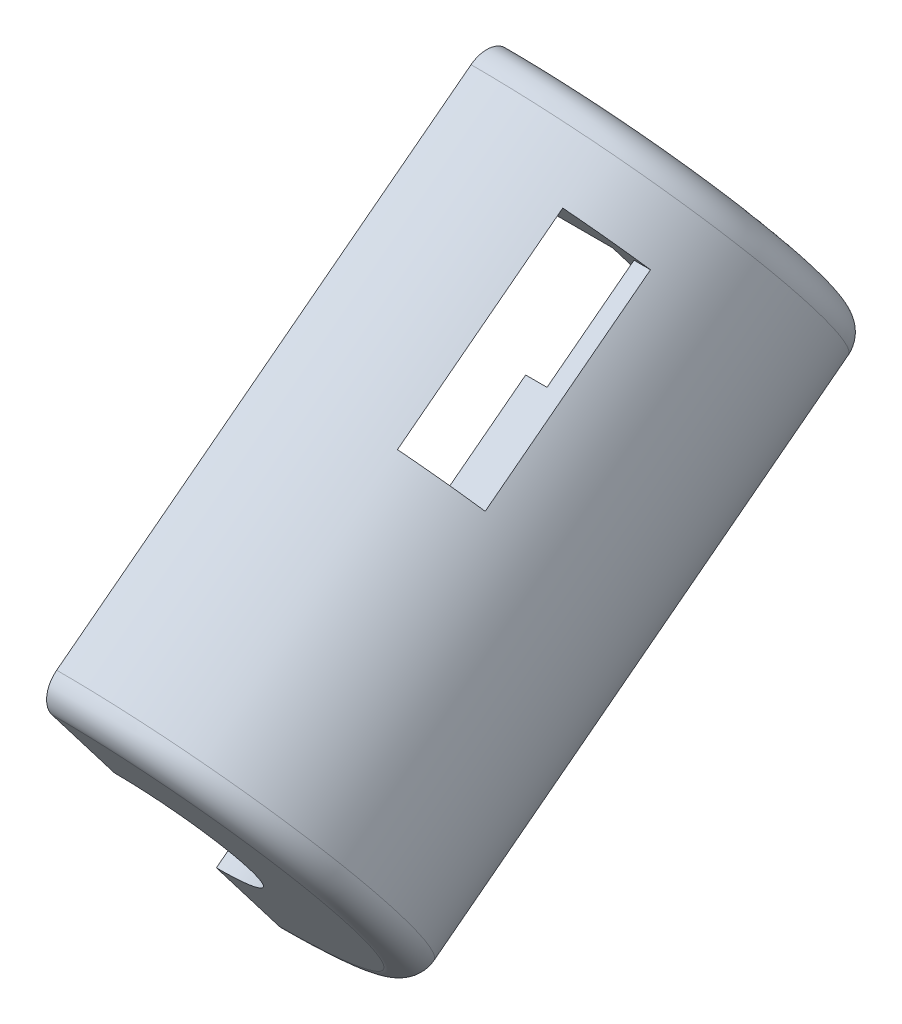
ISO-10303-21;
HEADER;
FILE_DESCRIPTION(('STEP AP214'),'2;1');
FILE_NAME('part.step','',(''),(''),'','','');
FILE_SCHEMA(('AUTOMOTIVE_DESIGN { 1 0 10303 214 1 1 1 1 }'));
ENDSEC;
DATA;
#1=APPLICATION_CONTEXT('core data for automotive mechanical design processes');
#2=APPLICATION_PROTOCOL_DEFINITION('international standard','automotive_design',2000,#1);
#3=PRODUCT_CONTEXT('',#1,'mechanical');
#4=PRODUCT('Part','Part','',(#3));
#5=PRODUCT_RELATED_PRODUCT_CATEGORY('part','',(#4));
#6=PRODUCT_DEFINITION_FORMATION('','',#4);
#7=PRODUCT_DEFINITION_CONTEXT('part definition',#1,'design');
#8=PRODUCT_DEFINITION('design','',#6,#7);
#9=PRODUCT_DEFINITION_SHAPE('','',#8);
#10=(LENGTH_UNIT() NAMED_UNIT(*) SI_UNIT(.MILLI.,.METRE.));
#11=(NAMED_UNIT(*) PLANE_ANGLE_UNIT() SI_UNIT($,.RADIAN.));
#12=(NAMED_UNIT(*) SI_UNIT($,.STERADIAN.) SOLID_ANGLE_UNIT());
#13=UNCERTAINTY_MEASURE_WITH_UNIT(LENGTH_MEASURE(1.E-05),#10,'distance_accuracy_value','');
#14=(GEOMETRIC_REPRESENTATION_CONTEXT(3) GLOBAL_UNCERTAINTY_ASSIGNED_CONTEXT((#13)) GLOBAL_UNIT_ASSIGNED_CONTEXT((#10,
#11,#12)) REPRESENTATION_CONTEXT('',''));
#15=CARTESIAN_POINT('',(0.,0.,0.));
#16=DIRECTION('',(0.,0.,1.));
#17=DIRECTION('',(1.,0.,0.));
#18=AXIS2_PLACEMENT_3D('',#15,#16,#17);
#19=CARTESIAN_POINT('',(88.,103.26130128257,131.19163509689));
#20=DIRECTION('',(0.,-0.607891189803704,0.794020340645652));
#21=DIRECTION('',(0.,0.794020340645652,0.607891189803704));
#22=AXIS2_PLACEMENT_3D('',#19,#20,#21);
#23=PLANE('',#22);
#24=DIRECTION('',(0.,0.794020340645652,0.607891189803704));
#25=VECTOR('',#24,1.);
#26=CARTESIAN_POINT('',(40.2,84.2048131070744,116.602246541601));
#27=LINE('',#26,#25);
#28=CARTESIAN_POINT('',(40.2,84.2048131070744,116.602246541601));
#29=VERTEX_POINT('',#28);
#30=CARTESIAN_POINT('',(40.2,100.085219919987,128.760070337675));
#31=VERTEX_POINT('',#30);
#32=EDGE_CURVE('E189',#29,#31,#27,.T.);
#33=ORIENTED_EDGE('',*,*,#32,.F.);
#34=DIRECTION('',(-1.,0.,0.));
#35=VECTOR('',#34,1.);
#36=CARTESIAN_POINT('',(88.,84.2048131070744,116.602246541601));
#37=LINE('',#36,#35);
#38=CARTESIAN_POINT('',(30.,84.2048131070744,116.602246541601));
#39=VERTEX_POINT('',#38);
#40=EDGE_CURVE('E199',#29,#39,#37,.T.);
#41=ORIENTED_EDGE('',*,*,#40,.T.);
#42=DIRECTION('',(0.,-0.794020340645652,-0.607891189803704));
#43=VECTOR('',#42,1.);
#44=CARTESIAN_POINT('',(30.,84.2048131070744,116.602246541601));
#45=LINE('',#44,#43);
#46=CARTESIAN_POINT('',(30.,81.0287317444918,114.170681782386));
#47=VERTEX_POINT('',#46);
#48=EDGE_CURVE('E252',#39,#47,#45,.T.);
#49=ORIENTED_EDGE('',*,*,#48,.T.);
#50=DIRECTION('',(-1.,0.,0.));
#51=VECTOR('',#50,1.);
#52=CARTESIAN_POINT('',(88.,81.0287317444918,114.170681782386));
#53=LINE('',#52,#51);
#54=CARTESIAN_POINT('',(38.7017386664809,81.0287317444918,114.170681782386));
#55=VERTEX_POINT('',#54);
#56=EDGE_CURVE('E269',#47,#55,#53,.F.);
#57=ORIENTED_EDGE('',*,*,#56,.T.);
#58=CARTESIAN_POINT('',(30.,92.1600287928982,122.692651636851));
#59=DIRECTION('',(0.,0.607891189803704,-0.794020340645652));
#60=DIRECTION('',(0.,0.794020340645652,0.607891189803704));
#61=AXIS2_PLACEMENT_3D('',#58,#59,#60);
#62=CIRCLE('',#61,16.5);
#63=CARTESIAN_POINT('',(43.1099774663335,84.2048131070744,116.602246541601));
#64=VERTEX_POINT('',#63);
#65=EDGE_CURVE('E27',#55,#64,#62,.F.);
#66=ORIENTED_EDGE('',*,*,#65,.T.);
#67=DIRECTION('',(-1.,0.,0.));
#68=VECTOR('',#67,1.);
#69=CARTESIAN_POINT('',(88.,84.2048131070744,116.602246541601));
#70=LINE('',#69,#68);
#71=CARTESIAN_POINT('',(41.8267285911098,84.2048131070744,116.602246541601));
#72=VERTEX_POINT('',#71);
#73=EDGE_CURVE('E207',#72,#64,#70,.F.);
#74=ORIENTED_EDGE('',*,*,#73,.F.);
#75=CARTESIAN_POINT('',(30.,92.1600287928982,122.692651636851));
#76=DIRECTION('',(0.,-0.607891189803704,0.794020340645652));
#77=DIRECTION('',(0.,-0.794020340645652,-0.607891189803704));
#78=AXIS2_PLACEMENT_3D('',#75,#76,#77);
#79=CIRCLE('',#78,15.5);
#80=CARTESIAN_POINT('',(41.8586582676119,100.085219919987,128.760070337675));
#81=VERTEX_POINT('',#80);
#82=EDGE_CURVE('E238',#72,#81,#79,.T.);
#83=ORIENTED_EDGE('',*,*,#82,.T.);
#84=DIRECTION('',(-1.,0.,0.));
#85=VECTOR('',#84,1.);
#86=CARTESIAN_POINT('',(88.,100.085219919987,128.760070337675));
#87=LINE('',#86,#85);
#88=CARTESIAN_POINT('',(43.1387889817897,100.085219919987,128.760070337675));
#89=VERTEX_POINT('',#88);
#90=EDGE_CURVE('E289',#81,#89,#87,.F.);
#91=ORIENTED_EDGE('',*,*,#90,.T.);
#92=CARTESIAN_POINT('',(30.,92.1600287928982,122.692651636851));
#93=DIRECTION('',(0.,0.607891189803704,-0.794020340645652));
#94=DIRECTION('',(0.,0.794020340645652,0.607891189803704));
#95=AXIS2_PLACEMENT_3D('',#92,#93,#94);
#96=CIRCLE('',#95,16.5);
#97=CARTESIAN_POINT('',(38.7623643644877,103.26130128257,131.19163509689));
#98=VERTEX_POINT('',#97);
#99=EDGE_CURVE('E408',#89,#98,#96,.F.);
#100=ORIENTED_EDGE('',*,*,#99,.T.);
#101=DIRECTION('',(-1.,0.,0.));
#102=VECTOR('',#101,1.);
#103=CARTESIAN_POINT('',(88.,103.26130128257,131.19163509689));
#104=LINE('',#103,#102);
#105=CARTESIAN_POINT('',(30.,103.26130128257,131.19163509689));
#106=VERTEX_POINT('',#105);
#107=EDGE_CURVE('E291',#106,#98,#104,.F.);
#108=ORIENTED_EDGE('',*,*,#107,.F.);
#109=DIRECTION('',(0.,-0.794020340645652,-0.607891189803704));
#110=VECTOR('',#109,1.);
#111=CARTESIAN_POINT('',(30.,103.26130128257,131.19163509689));
#112=LINE('',#111,#110);
#113=CARTESIAN_POINT('',(30.,100.085219919987,128.760070337675));
#114=VERTEX_POINT('',#113);
#115=EDGE_CURVE('E279',#106,#114,#112,.T.);
#116=ORIENTED_EDGE('',*,*,#115,.T.);
#117=DIRECTION('',(-1.,0.,0.));
#118=VECTOR('',#117,1.);
#119=CARTESIAN_POINT('',(88.,100.085219919987,128.760070337675));
#120=LINE('',#119,#118);
#121=EDGE_CURVE('E211',#31,#114,#120,.T.);
#122=ORIENTED_EDGE('',*,*,#121,.F.);
#123=EDGE_LOOP('',(#33,#41,#49,#57,#66,#74,#83,#91,#100,#108,#116,#122));
#124=FACE_BOUND('',#123,.T.);
#125=ADVANCED_FACE('F17',(#124),#23,.T.);
#126=CARTESIAN_POINT('',(88.,75.8616566311603,120.919854677874));
#127=DIRECTION('',(0.,0.607891189803704,-0.794020340645652));
#128=DIRECTION('',(0.,-0.794020340645652,-0.607891189803704));
#129=AXIS2_PLACEMENT_3D('',#126,#127,#128);
#130=PLANE('',#129);
#131=DIRECTION('',(0.,-0.794020340645652,-0.607891189803704));
#132=VECTOR('',#131,1.);
#133=CARTESIAN_POINT('',(40.2,94.9181448066559,135.509243233163));
#134=LINE('',#133,#132);
#135=CARTESIAN_POINT('',(40.2,94.9181448066559,135.509243233163));
#136=VERTEX_POINT('',#135);
#137=CARTESIAN_POINT('',(40.2,79.0377379937429,123.351419437089));
#138=VERTEX_POINT('',#137);
#139=EDGE_CURVE('E196',#136,#138,#134,.T.);
#140=ORIENTED_EDGE('',*,*,#139,.F.);
#141=DIRECTION('',(1.,0.,0.));
#142=VECTOR('',#141,1.);
#143=CARTESIAN_POINT('',(88.,94.9181448066559,135.509243233163));
#144=LINE('',#143,#142);
#145=CARTESIAN_POINT('',(41.8586582676119,94.9181448066559,135.509243233163));
#146=VERTEX_POINT('',#145);
#147=EDGE_CURVE('E242',#136,#146,#144,.T.);
#148=ORIENTED_EDGE('',*,*,#147,.T.);
#149=CARTESIAN_POINT('',(30.,86.9929536795667,129.441824532339));
#150=DIRECTION('',(0.,-0.607891189803704,0.794020340645652));
#151=DIRECTION('',(0.,-0.794020340645652,-0.607891189803704));
#152=AXIS2_PLACEMENT_3D('',#149,#150,#151);
#153=CIRCLE('',#152,15.5);
#154=CARTESIAN_POINT('',(41.8267285911098,79.0377379937429,123.351419437089));
#155=VERTEX_POINT('',#154);
#156=EDGE_CURVE('E237',#155,#146,#153,.T.);
#157=ORIENTED_EDGE('',*,*,#156,.F.);
#158=DIRECTION('',(-1.,0.,0.));
#159=VECTOR('',#158,1.);
#160=CARTESIAN_POINT('',(88.,79.0377379937429,123.351419437089));
#161=LINE('',#160,#159);
#162=CARTESIAN_POINT('',(43.1099774663335,79.0377379937429,123.351419437089));
#163=VERTEX_POINT('',#162);
#164=EDGE_CURVE('E264',#155,#163,#161,.F.);
#165=ORIENTED_EDGE('',*,*,#164,.T.);
#166=CARTESIAN_POINT('',(30.,86.9929536795667,129.441824532339));
#167=DIRECTION('',(0.,-0.607891189803704,0.794020340645652));
#168=DIRECTION('',(0.,-0.794020340645652,-0.607891189803704));
#169=AXIS2_PLACEMENT_3D('',#166,#167,#168);
#170=CIRCLE('',#169,16.5);
#171=CARTESIAN_POINT('',(38.7017386664809,75.8616566311603,120.919854677874));
#172=VERTEX_POINT('',#171);
#173=EDGE_CURVE('E425',#163,#172,#170,.F.);
#174=ORIENTED_EDGE('',*,*,#173,.T.);
#175=DIRECTION('',(-1.,0.,0.));
#176=VECTOR('',#175,1.);
#177=CARTESIAN_POINT('',(88.,75.8616566311603,120.919854677874));
#178=LINE('',#177,#176);
#179=CARTESIAN_POINT('',(30.,75.8616566311603,120.919854677874));
#180=VERTEX_POINT('',#179);
#181=EDGE_CURVE('E265',#180,#172,#178,.F.);
#182=ORIENTED_EDGE('',*,*,#181,.F.);
#183=DIRECTION('',(0.,0.794020340645652,0.607891189803704));
#184=VECTOR('',#183,1.);
#185=CARTESIAN_POINT('',(30.,75.8616566311603,120.919854677874));
#186=LINE('',#185,#184);
#187=CARTESIAN_POINT('',(30.,79.0377379937429,123.351419437089));
#188=VERTEX_POINT('',#187);
#189=EDGE_CURVE('E208',#180,#188,#186,.T.);
#190=ORIENTED_EDGE('',*,*,#189,.T.);
#191=DIRECTION('',(-1.,0.,0.));
#192=VECTOR('',#191,1.);
#193=CARTESIAN_POINT('',(88.,79.0377379937429,123.351419437089));
#194=LINE('',#193,#192);
#195=EDGE_CURVE('E261',#138,#188,#194,.T.);
#196=ORIENTED_EDGE('',*,*,#195,.F.);
#197=EDGE_LOOP('',(#140,#148,#157,#165,#174,#182,#190,#196));
#198=FACE_BOUND('',#197,.T.);
#199=ADVANCED_FACE('F541',(#198),#130,.T.);
#200=CARTESIAN_POINT('',(88.,94.9181448066559,135.509243233163));
#201=DIRECTION('',(0.,0.794020340645652,0.607891189803704));
#202=DIRECTION('',(-1.,0.,0.));
#203=AXIS2_PLACEMENT_3D('',#200,#201,#202);
#204=PLANE('',#203);
#205=DIRECTION('',(0.,0.607891189803704,-0.794020340645652));
#206=VECTOR('',#205,1.);
#207=CARTESIAN_POINT('',(40.2,77.8971914921522,157.741812771242));
#208=LINE('',#207,#206);
#209=CARTESIAN_POINT('',(40.2,90.2641633187529,141.588219254475));
#210=VERTEX_POINT('',#209);
#211=EDGE_CURVE('E227',#136,#210,#208,.F.);
#212=ORIENTED_EDGE('',*,*,#211,.T.);
#213=DIRECTION('',(-1.,0.,0.));
#214=VECTOR('',#213,1.);
#215=CARTESIAN_POINT('',(88.,90.2641633187529,141.588219254475));
#216=LINE('',#215,#214);
#217=CARTESIAN_POINT('',(43.1387889817897,90.2641633187529,141.588219254475));
#218=VERTEX_POINT('',#217);
#219=EDGE_CURVE('E298',#210,#218,#216,.F.);
#220=ORIENTED_EDGE('',*,*,#219,.T.);
#221=DIRECTION('',(0.,-0.607891189803704,0.794020340645652));
#222=VECTOR('',#221,1.);
#223=CARTESIAN_POINT('',(43.1387889817897,103.73256705881,123.995948293801));
#224=LINE('',#223,#222);
#225=EDGE_CURVE('E405',#218,#89,#224,.F.);
#226=ORIENTED_EDGE('',*,*,#225,.T.);
#227=ORIENTED_EDGE('',*,*,#90,.F.);
#228=DIRECTION('',(0.,-0.607891189803704,0.794020340645652));
#229=VECTOR('',#228,1.);
#230=CARTESIAN_POINT('',(41.8586582676119,100.085219919987,128.760070337675));
#231=LINE('',#230,#229);
#232=EDGE_CURVE('E249',#146,#81,#231,.F.);
#233=ORIENTED_EDGE('',*,*,#232,.F.);
#234=ORIENTED_EDGE('',*,*,#147,.F.);
#235=EDGE_LOOP('',(#212,#220,#226,#227,#233,#234));
#236=FACE_BOUND('',#235,.T.);
#237=ADVANCED_FACE('F466',(#236),#204,.T.);
#238=CARTESIAN_POINT('',(88.,79.0377379937429,123.351419437089));
#239=DIRECTION('',(0.,-0.794020340645652,-0.607891189803704));
#240=DIRECTION('',(1.,0.,0.));
#241=AXIS2_PLACEMENT_3D('',#238,#239,#240);
#242=PLANE('',#241);
#243=ORIENTED_EDGE('',*,*,#73,.T.);
#244=DIRECTION('',(0.,-0.607891189803704,0.794020340645652));
#245=VECTOR('',#244,1.);
#246=CARTESIAN_POINT('',(43.1099774663335,87.8521602458966,111.838124497727));
#247=LINE('',#246,#245);
#248=EDGE_CURVE('E416',#64,#163,#247,.T.);
#249=ORIENTED_EDGE('',*,*,#248,.T.);
#250=ORIENTED_EDGE('',*,*,#164,.F.);
#251=DIRECTION('',(0.,-0.607891189803704,0.794020340645652));
#252=VECTOR('',#251,1.);
#253=CARTESIAN_POINT('',(41.8267285911098,84.2048131070744,116.602246541601));
#254=LINE('',#253,#252);
#255=EDGE_CURVE('E11',#72,#155,#254,.T.);
#256=ORIENTED_EDGE('',*,*,#255,.F.);
#257=EDGE_LOOP('',(#243,#249,#250,#256));
#258=FACE_BOUND('',#257,.T.);
#259=ADVANCED_FACE('F535',(#258),#242,.T.);
#260=CARTESIAN_POINT('',(40.,86.6363778662892,113.426165179018));
#261=DIRECTION('',(0.,0.794020340645652,0.607891189803704));
#262=DIRECTION('',(-1.,0.,0.));
#263=AXIS2_PLACEMENT_3D('',#260,#261,#262);
#264=PLANE('',#263);
#265=DIRECTION('',(-1.,0.,0.));
#266=VECTOR('',#265,1.);
#267=CARTESIAN_POINT('',(40.,86.6363778662892,113.426165179018));
#268=LINE('',#267,#266);
#269=CARTESIAN_POINT('',(30.,86.6363778662892,113.426165179018));
#270=VERTEX_POINT('',#269);
#271=CARTESIAN_POINT('',(40.2,86.6363778662892,113.426165179018));
#272=VERTEX_POINT('',#271);
#273=EDGE_CURVE('E344',#270,#272,#268,.F.);
#274=ORIENTED_EDGE('',*,*,#273,.F.);
#275=DIRECTION('',(0.,-0.607891189803704,0.794020340645652));
#276=VECTOR('',#275,1.);
#277=CARTESIAN_POINT('',(30.,86.6363778662892,113.426165179018));
#278=LINE('',#277,#276);
#279=EDGE_CURVE('E202',#270,#39,#278,.T.);
#280=ORIENTED_EDGE('',*,*,#279,.T.);
#281=ORIENTED_EDGE('',*,*,#40,.F.);
#282=DIRECTION('',(0.,-0.607891189803704,0.794020340645652));
#283=VECTOR('',#282,1.);
#284=CARTESIAN_POINT('',(40.2,86.6363778662892,113.426165179018));
#285=LINE('',#284,#283);
#286=EDGE_CURVE('E185',#272,#29,#285,.T.);
#287=ORIENTED_EDGE('',*,*,#286,.F.);
#288=EDGE_LOOP('',(#274,#280,#281,#287));
#289=FACE_BOUND('',#288,.T.);
#290=ADVANCED_FACE('F200',(#289),#264,.T.);
#291=CARTESIAN_POINT('',(30.,95.8073759317204,117.928529592977));
#292=DIRECTION('',(0.,-0.607891189803704,0.794020340645652));
#293=DIRECTION('',(0.,0.794020340645652,0.607891189803704));
#294=AXIS2_PLACEMENT_3D('',#291,#292,#293);
#295=CYLINDRICAL_SURFACE('',#294,16.5);
#296=DIRECTION('',(0.,-0.607891189803704,0.794020340645652));
#297=VECTOR('',#296,1.);
#298=CARTESIAN_POINT('',(30.,108.908711552374,127.958734224738));
#299=LINE('',#298,#297);
#300=CARTESIAN_POINT('',(30.,107.692929172766,129.546774906029));
#301=VERTEX_POINT('',#300);
#302=CARTESIAN_POINT('',(30.,83.0733359857163,161.704598702179));
#303=VERTEX_POINT('',#302);
#304=EDGE_CURVE('E367',#301,#303,#299,.T.);
#305=ORIENTED_EDGE('',*,*,#304,.T.);
#306=CARTESIAN_POINT('',(30.,69.972000365063,151.674394070417));
#307=DIRECTION('',(0.,0.607891189803704,-0.794020340645652));
#308=DIRECTION('',(0.,0.794020340645652,0.607891189803704));
#309=AXIS2_PLACEMENT_3D('',#306,#307,#308);
#310=CIRCLE('',#309,16.5);
#311=CARTESIAN_POINT('',(30.,56.8706647444098,141.644189438656));
#312=VERTEX_POINT('',#311);
#313=EDGE_CURVE('E380',#312,#303,#310,.F.);
#314=ORIENTED_EDGE('',*,*,#313,.F.);
#315=DIRECTION('',(0.,-0.607891189803704,0.794020340645652));
#316=VECTOR('',#315,1.);
#317=CARTESIAN_POINT('',(30.,82.7060403110672,107.898324961216));
#318=LINE('',#317,#316);
#319=CARTESIAN_POINT('',(30.,81.4902579314598,109.486365642507));
#320=VERTEX_POINT('',#319);
#321=EDGE_CURVE('E361',#312,#320,#318,.F.);
#322=ORIENTED_EDGE('',*,*,#321,.T.);
#323=CARTESIAN_POINT('',(30.,94.591593552113,119.516570274268));
#324=DIRECTION('',(0.,0.607891189803704,-0.794020340645652));
#325=DIRECTION('',(0.,0.794020340645652,0.607891189803704));
#326=AXIS2_PLACEMENT_3D('',#323,#324,#325);
#327=CIRCLE('',#326,16.5);
#328=EDGE_CURVE('E388',#301,#320,#327,.T.);
#329=ORIENTED_EDGE('',*,*,#328,.F.);
#330=EDGE_LOOP('',(#305,#314,#322,#329));
#331=FACE_BOUND('',#330,.T.);
#332=ORIENTED_EDGE('',*,*,#99,.F.);
#333=ORIENTED_EDGE('',*,*,#225,.F.);
#334=CARTESIAN_POINT('',(30.,82.3389721916637,135.520800553651));
#335=DIRECTION('',(0.,-0.607891189803704,0.794020340645652));
#336=DIRECTION('',(0.,-0.794020340645652,-0.607891189803704));
#337=AXIS2_PLACEMENT_3D('',#334,#335,#336);
#338=CIRCLE('',#337,16.5);
#339=CARTESIAN_POINT('',(38.7623643644877,93.4402446813355,144.019784013689));
#340=VERTEX_POINT('',#339);
#341=EDGE_CURVE('E402',#340,#218,#338,.F.);
#342=ORIENTED_EDGE('',*,*,#341,.F.);
#343=DIRECTION('',(0.,-0.607891189803704,0.794020340645652));
#344=VECTOR('',#343,1.);
#345=CARTESIAN_POINT('',(38.7623643644877,106.908648421392,126.427513053016));
#346=LINE('',#345,#344);
#347=EDGE_CURVE('E412',#98,#340,#346,.T.);
#348=ORIENTED_EDGE('',*,*,#347,.F.);
#349=EDGE_LOOP('',(#332,#333,#342,#348));
#350=FACE_BOUND('',#349,.T.);
#351=DIRECTION('',(0.,-0.607891189803704,0.794020340645652));
#352=VECTOR('',#351,1.);
#353=CARTESIAN_POINT('',(38.7017386664809,84.676078883314,109.406559738512));
#354=LINE('',#353,#352);
#355=EDGE_CURVE('E272',#172,#55,#354,.F.);
#356=ORIENTED_EDGE('',*,*,#355,.F.);
#357=ORIENTED_EDGE('',*,*,#173,.F.);
#358=ORIENTED_EDGE('',*,*,#248,.F.);
#359=ORIENTED_EDGE('',*,*,#65,.F.);
#360=EDGE_LOOP('',(#356,#357,#358,#359));
#361=FACE_BOUND('',#360,.T.);
#362=ADVANCED_FACE('F462',(#331,#350,#361),#295,.T.);
#363=CARTESIAN_POINT('',(30.,82.7060403110672,107.898324961216));
#364=DIRECTION('',(-1.,0.,0.));
#365=DIRECTION('',(0.,-0.794020340645652,-0.607891189803704));
#366=AXIS2_PLACEMENT_3D('',#363,#364,#365);
#367=PLANE('',#366);
#368=ORIENTED_EDGE('',*,*,#279,.F.);
#369=DIRECTION('',(0.,-0.794020340645652,-0.607891189803704));
#370=VECTOR('',#369,1.);
#371=CARTESIAN_POINT('',(30.,102.516784679202,125.583988975092));
#372=LINE('',#371,#370);
#373=CARTESIAN_POINT('',(30.,89.4304613379163,115.565277540544));
#374=VERTEX_POINT('',#373);
#375=EDGE_CURVE('E335',#374,#270,#372,.T.);
#376=ORIENTED_EDGE('',*,*,#375,.F.);
#377=DIRECTION('',(0.,0.607891189803704,-0.794020340645652));
#378=VECTOR('',#377,1.);
#379=CARTESIAN_POINT('',(30.,89.4304613379163,115.565277540544));
#380=LINE('',#379,#378);
#381=CARTESIAN_POINT('',(30.,90.6462437175237,113.977236859253));
#382=VERTEX_POINT('',#381);
#383=EDGE_CURVE('E307',#374,#382,#380,.T.);
#384=ORIENTED_EDGE('',*,*,#383,.T.);
#385=DIRECTION('',(0.,0.794020340645652,0.607891189803704));
#386=VECTOR('',#385,1.);
#387=CARTESIAN_POINT('',(30.,82.7060403110672,107.898324961216));
#388=LINE('',#387,#386);
#389=CARTESIAN_POINT('',(30.,84.2940809923585,109.114107340823));
#390=VERTEX_POINT('',#389);
#391=EDGE_CURVE('E357',#390,#382,#388,.T.);
#392=ORIENTED_EDGE('',*,*,#391,.F.);
#393=CARTESIAN_POINT('',(30.,83.0782986127511,110.702148022115));
#394=DIRECTION('',(1.,0.,0.));
#395=DIRECTION('',(0.,-0.794020340645652,-0.607891189803704));
#396=AXIS2_PLACEMENT_3D('',#393,#394,#395);
#397=CIRCLE('',#396,2.);
#398=EDGE_CURVE('E392',#320,#390,#397,.T.);
#399=ORIENTED_EDGE('',*,*,#398,.F.);
#400=ORIENTED_EDGE('',*,*,#321,.F.);
#401=CARTESIAN_POINT('',(30.,58.4587054257011,142.859971818264));
#402=DIRECTION('',(1.,0.,0.));
#403=DIRECTION('',(0.,-0.794020340645652,-0.607891189803704));
#404=AXIS2_PLACEMENT_3D('',#401,#402,#403);
#405=CIRCLE('',#404,2.);
#406=CARTESIAN_POINT('',(30.,57.2429230460936,144.448012499555));
#407=VERTEX_POINT('',#406);
#408=EDGE_CURVE('E377',#407,#312,#405,.T.);
#409=ORIENTED_EDGE('',*,*,#408,.F.);
#410=DIRECTION('',(0.,0.794020340645652,0.607891189803704));
#411=VECTOR('',#410,1.);
#412=CARTESIAN_POINT('',(30.,55.6548823648023,143.232230119947));
#413=LINE('',#412,#411);
#414=CARTESIAN_POINT('',(30.,63.5950857712589,149.311142017985));
#415=VERTEX_POINT('',#414);
#416=EDGE_CURVE('E363',#407,#415,#413,.T.);
#417=ORIENTED_EDGE('',*,*,#416,.T.);
#418=DIRECTION('',(0.,-0.607891189803704,0.794020340645652));
#419=VECTOR('',#418,1.);
#420=CARTESIAN_POINT('',(30.,64.8108681508663,147.723101336693));
#421=LINE('',#420,#419);
#422=CARTESIAN_POINT('',(30.,64.8108681508663,147.723101336693));
#423=VERTEX_POINT('',#422);
#424=EDGE_CURVE('E315',#415,#423,#421,.F.);
#425=ORIENTED_EDGE('',*,*,#424,.T.);
#426=DIRECTION('',(0.,0.794020340645652,0.607891189803704));
#427=VECTOR('',#426,1.);
#428=CARTESIAN_POINT('',(30.,62.0167846792392,145.583988975167));
#429=LINE('',#428,#427);
#430=CARTESIAN_POINT('',(30.,62.0167846792392,145.583988975167));
#431=VERTEX_POINT('',#430);
#432=EDGE_CURVE('E326',#431,#423,#429,.T.);
#433=ORIENTED_EDGE('',*,*,#432,.F.);
#434=EDGE_CURVE('E340',#188,#431,#278,.T.);
#435=ORIENTED_EDGE('',*,*,#434,.F.);
#436=ORIENTED_EDGE('',*,*,#189,.F.);
#437=DIRECTION('',(0.,-0.607891189803704,0.794020340645652));
#438=VECTOR('',#437,1.);
#439=CARTESIAN_POINT('',(30.,81.0287317444918,114.170681782386));
#440=LINE('',#439,#438);
#441=EDGE_CURVE('E255',#47,#180,#440,.T.);
#442=ORIENTED_EDGE('',*,*,#441,.F.);
#443=ORIENTED_EDGE('',*,*,#48,.F.);
#444=EDGE_LOOP('',(#368,#376,#384,#392,#399,#400,#409,#417,#425,#433,#435,#436,#442,#443));
#445=FACE_BOUND('',#444,.T.);
#446=ADVANCED_FACE('F524',(#445),#367,.T.);
#447=CARTESIAN_POINT('',(40.,77.8971914921522,157.741812771242));
#448=DIRECTION('',(0.,-0.794020340645652,-0.607891189803704));
#449=DIRECTION('',(1.,0.,0.));
#450=AXIS2_PLACEMENT_3D('',#447,#448,#449);
#451=PLANE('',#450);
#452=DIRECTION('',(-1.,0.,0.));
#453=VECTOR('',#452,1.);
#454=CARTESIAN_POINT('',(40.,77.8971914921522,157.741812771242));
#455=LINE('',#454,#453);
#456=CARTESIAN_POINT('',(30.,77.8971914921522,157.741812771242));
#457=VERTEX_POINT('',#456);
#458=CARTESIAN_POINT('',(40.2,77.8971914921522,157.741812771242));
#459=VERTEX_POINT('',#458);
#460=EDGE_CURVE('E350',#457,#459,#455,.F.);
#461=ORIENTED_EDGE('',*,*,#460,.F.);
#462=DIRECTION('',(0.,0.607891189803704,-0.794020340645652));
#463=VECTOR('',#462,1.);
#464=CARTESIAN_POINT('',(30.,77.8971914921522,157.741812771242));
#465=LINE('',#464,#463);
#466=CARTESIAN_POINT('',(30.,90.2641633187529,141.588219254475));
#467=VERTEX_POINT('',#466);
#468=EDGE_CURVE('E331',#457,#467,#465,.T.);
#469=ORIENTED_EDGE('',*,*,#468,.T.);
#470=DIRECTION('',(-1.,0.,0.));
#471=VECTOR('',#470,1.);
#472=CARTESIAN_POINT('',(88.,90.2641633187529,141.588219254475));
#473=LINE('',#472,#471);
#474=EDGE_CURVE('E290',#210,#467,#473,.T.);
#475=ORIENTED_EDGE('',*,*,#474,.F.);
#476=EDGE_CURVE('E226',#210,#459,#208,.F.);
#477=ORIENTED_EDGE('',*,*,#476,.T.);
#478=EDGE_LOOP('',(#461,#469,#475,#477));
#479=FACE_BOUND('',#478,.T.);
#480=ADVANCED_FACE('F450',(#479),#451,.T.);
#481=ORIENTED_EDGE('',*,*,#468,.F.);
#482=CARTESIAN_POINT('',(30.,75.1331325792597,155.625686804141));
#483=VERTEX_POINT('',#482);
#484=EDGE_CURVE('E325',#483,#457,#429,.T.);
#485=ORIENTED_EDGE('',*,*,#484,.F.);
#486=DIRECTION('',(0.,-0.607891189803704,0.794020340645652));
#487=VECTOR('',#486,1.);
#488=CARTESIAN_POINT('',(30.,75.1331325792597,155.625686804141));
#489=LINE('',#488,#487);
#490=CARTESIAN_POINT('',(30.,73.9173501996523,157.213727485432));
#491=VERTEX_POINT('',#490);
#492=EDGE_CURVE('E321',#483,#491,#489,.T.);
#493=ORIENTED_EDGE('',*,*,#492,.T.);
#494=CARTESIAN_POINT('',(30.,80.2695129248175,162.076857003862));
#495=VERTEX_POINT('',#494);
#496=EDGE_CURVE('E354',#491,#495,#413,.T.);
#497=ORIENTED_EDGE('',*,*,#496,.T.);
#498=CARTESIAN_POINT('',(30.,81.485295304425,160.488816322571));
#499=DIRECTION('',(1.,0.,0.));
#500=DIRECTION('',(0.,-0.794020340645652,-0.607891189803704));
#501=AXIS2_PLACEMENT_3D('',#498,#499,#500);
#502=CIRCLE('',#501,2.);
#503=EDGE_CURVE('E384',#303,#495,#502,.T.);
#504=ORIENTED_EDGE('',*,*,#503,.F.);
#505=ORIENTED_EDGE('',*,*,#304,.F.);
#506=CARTESIAN_POINT('',(30.,106.104888491475,128.330992526422));
#507=DIRECTION('',(1.,0.,0.));
#508=DIRECTION('',(0.,-0.794020340645652,-0.607891189803704));
#509=AXIS2_PLACEMENT_3D('',#506,#507,#508);
#510=CIRCLE('',#509,2.);
#511=CARTESIAN_POINT('',(30.,107.320670871082,126.742951845131));
#512=VERTEX_POINT('',#511);
#513=EDGE_CURVE('E399',#512,#301,#510,.T.);
#514=ORIENTED_EDGE('',*,*,#513,.F.);
#515=CARTESIAN_POINT('',(30.,100.968508145917,121.879822326701));
#516=VERTEX_POINT('',#515);
#517=EDGE_CURVE('E362',#516,#512,#388,.T.);
#518=ORIENTED_EDGE('',*,*,#517,.F.);
#519=DIRECTION('',(0.,0.607891189803704,-0.794020340645652));
#520=VECTOR('',#519,1.);
#521=CARTESIAN_POINT('',(30.,99.7527257663098,123.467863007992));
#522=LINE('',#521,#520);
#523=CARTESIAN_POINT('',(30.,99.7527257663098,123.467863007992));
#524=VERTEX_POINT('',#523);
#525=EDGE_CURVE('E302',#516,#524,#522,.F.);
#526=ORIENTED_EDGE('',*,*,#525,.T.);
#527=CARTESIAN_POINT('',(30.,102.516784679202,125.583988975092));
#528=VERTEX_POINT('',#527);
#529=EDGE_CURVE('E336',#528,#524,#372,.T.);
#530=ORIENTED_EDGE('',*,*,#529,.F.);
#531=EDGE_CURVE('E330',#114,#528,#465,.T.);
#532=ORIENTED_EDGE('',*,*,#531,.F.);
#533=ORIENTED_EDGE('',*,*,#115,.F.);
#534=DIRECTION('',(0.,0.607891189803704,-0.794020340645652));
#535=VECTOR('',#534,1.);
#536=CARTESIAN_POINT('',(30.,98.0942261692385,137.940807992378));
#537=LINE('',#536,#535);
#538=CARTESIAN_POINT('',(30.,93.4402446813355,144.019784013689));
#539=VERTEX_POINT('',#538);
#540=EDGE_CURVE('E276',#539,#106,#537,.T.);
#541=ORIENTED_EDGE('',*,*,#540,.F.);
#542=DIRECTION('',(0.,0.794020340645652,0.607891189803704));
#543=VECTOR('',#542,1.);
#544=CARTESIAN_POINT('',(30.,90.2641633187529,141.588219254475));
#545=LINE('',#544,#543);
#546=EDGE_CURVE('E282',#467,#539,#545,.T.);
#547=ORIENTED_EDGE('',*,*,#546,.F.);
#548=EDGE_LOOP('',(#481,#485,#493,#497,#504,#505,#514,#518,#526,#530,#532,#533,#541,#547));
#549=FACE_BOUND('',#548,.T.);
#550=ADVANCED_FACE('F453',(#549),#367,.T.);
#551=CARTESIAN_POINT('',(30.,95.8073759317204,117.928529592977));
#552=DIRECTION('',(0.,-0.607891189803704,0.794020340645652));
#553=DIRECTION('',(0.,0.794020340645652,0.607891189803704));
#554=AXIS2_PLACEMENT_3D('',#551,#552,#553);
#555=PLANE('',#554);
#556=ORIENTED_EDGE('',*,*,#391,.T.);
#557=CARTESIAN_POINT('',(30.,95.8073759317204,117.928529592977));
#558=DIRECTION('',(0.,-0.607891189803704,0.794020340645652));
#559=DIRECTION('',(0.,-0.794020340645652,-0.607891189803704));
#560=AXIS2_PLACEMENT_3D('',#557,#558,#559);
#561=CIRCLE('',#560,6.5);
#562=EDGE_CURVE('E295',#382,#516,#561,.T.);
#563=ORIENTED_EDGE('',*,*,#562,.T.);
#564=ORIENTED_EDGE('',*,*,#517,.T.);
#565=CARTESIAN_POINT('',(30.,95.8073759317204,117.928529592977));
#566=DIRECTION('',(0.,0.607891189803704,-0.794020340645652));
#567=DIRECTION('',(0.,0.794020340645652,0.607891189803704));
#568=AXIS2_PLACEMENT_3D('',#565,#566,#567);
#569=CIRCLE('',#568,14.5);
#570=EDGE_CURVE('E396',#390,#512,#569,.F.);
#571=ORIENTED_EDGE('',*,*,#570,.F.);
#572=EDGE_LOOP('',(#556,#563,#564,#571));
#573=FACE_BOUND('',#572,.T.);
#574=ADVANCED_FACE('F675',(#573),#555,.F.);
#575=CARTESIAN_POINT('',(40.,102.516784679202,125.583988975092));
#576=DIRECTION('',(0.,-0.607891189803704,0.794020340645652));
#577=DIRECTION('',(0.,0.794020340645652,0.607891189803704));
#578=AXIS2_PLACEMENT_3D('',#575,#576,#577);
#579=PLANE('',#578);
#580=ORIENTED_EDGE('',*,*,#375,.T.);
#581=ORIENTED_EDGE('',*,*,#273,.T.);
#582=DIRECTION('',(0.,-0.794020340645652,-0.607891189803704));
#583=VECTOR('',#582,1.);
#584=CARTESIAN_POINT('',(40.2,102.516784679202,125.583988975092));
#585=LINE('',#584,#583);
#586=CARTESIAN_POINT('',(40.2,102.516784679202,125.583988975092));
#587=VERTEX_POINT('',#586);
#588=EDGE_CURVE('E191',#587,#272,#585,.T.);
#589=ORIENTED_EDGE('',*,*,#588,.F.);
#590=DIRECTION('',(-1.,0.,0.));
#591=VECTOR('',#590,1.);
#592=CARTESIAN_POINT('',(40.,102.516784679202,125.583988975092));
#593=LINE('',#592,#591);
#594=EDGE_CURVE('E347',#528,#587,#593,.F.);
#595=ORIENTED_EDGE('',*,*,#594,.F.);
#596=ORIENTED_EDGE('',*,*,#529,.T.);
#597=CARTESIAN_POINT('',(30.,94.591593552113,119.516570274268));
#598=DIRECTION('',(0.,-0.607891189803704,0.794020340645652));
#599=DIRECTION('',(0.,-0.794020340645652,-0.607891189803704));
#600=AXIS2_PLACEMENT_3D('',#597,#598,#599);
#601=CIRCLE('',#600,6.5);
#602=EDGE_CURVE('E299',#374,#524,#601,.T.);
#603=ORIENTED_EDGE('',*,*,#602,.F.);
#604=EDGE_LOOP('',(#580,#581,#589,#595,#596,#603));
#605=FACE_BOUND('',#604,.T.);
#606=ADVANCED_FACE('F521',(#605),#579,.T.);
#607=CARTESIAN_POINT('',(40.,62.0167846792392,145.583988975167));
#608=DIRECTION('',(0.,0.607891189803704,-0.794020340645652));
#609=DIRECTION('',(0.,-0.794020340645652,-0.607891189803704));
#610=AXIS2_PLACEMENT_3D('',#607,#608,#609);
#611=PLANE('',#610);
#612=ORIENTED_EDGE('',*,*,#484,.T.);
#613=ORIENTED_EDGE('',*,*,#460,.T.);
#614=DIRECTION('',(0.,0.794020340645652,0.607891189803704));
#615=VECTOR('',#614,1.);
#616=CARTESIAN_POINT('',(40.2,62.0167846792392,145.583988975167));
#617=LINE('',#616,#615);
#618=CARTESIAN_POINT('',(40.2,62.0167846792392,145.583988975167));
#619=VERTEX_POINT('',#618);
#620=EDGE_CURVE('E231',#459,#619,#617,.F.);
#621=ORIENTED_EDGE('',*,*,#620,.T.);
#622=DIRECTION('',(-1.,0.,0.));
#623=VECTOR('',#622,1.);
#624=CARTESIAN_POINT('',(40.,62.0167846792392,145.583988975167));
#625=LINE('',#624,#623);
#626=EDGE_CURVE('E343',#431,#619,#625,.F.);
#627=ORIENTED_EDGE('',*,*,#626,.F.);
#628=ORIENTED_EDGE('',*,*,#432,.T.);
#629=CARTESIAN_POINT('',(30.,69.972000365063,151.674394070417));
#630=DIRECTION('',(0.,0.607891189803704,-0.794020340645652));
#631=DIRECTION('',(0.,0.794020340645652,0.607891189803704));
#632=AXIS2_PLACEMENT_3D('',#629,#630,#631);
#633=CIRCLE('',#632,6.5);
#634=EDGE_CURVE('E312',#483,#423,#633,.T.);
#635=ORIENTED_EDGE('',*,*,#634,.F.);
#636=EDGE_LOOP('',(#612,#613,#621,#627,#628,#635));
#637=FACE_BOUND('',#636,.T.);
#638=ADVANCED_FACE('F546',(#637),#611,.T.);
#639=CARTESIAN_POINT('',(30.,68.7562179854556,153.262434751708));
#640=DIRECTION('',(0.,-0.607891189803704,0.794020340645652));
#641=DIRECTION('',(0.,0.794020340645652,0.607891189803704));
#642=AXIS2_PLACEMENT_3D('',#639,#640,#641);
#643=PLANE('',#642);
#644=ORIENTED_EDGE('',*,*,#496,.F.);
#645=CARTESIAN_POINT('',(30.,68.7562179854556,153.262434751708));
#646=DIRECTION('',(0.,0.607891189803704,-0.794020340645652));
#647=DIRECTION('',(0.,0.794020340645652,0.607891189803704));
#648=AXIS2_PLACEMENT_3D('',#645,#646,#647);
#649=CIRCLE('',#648,6.5);
#650=EDGE_CURVE('E311',#491,#415,#649,.T.);
#651=ORIENTED_EDGE('',*,*,#650,.T.);
#652=ORIENTED_EDGE('',*,*,#416,.F.);
#653=CARTESIAN_POINT('',(30.,68.7562179854556,153.262434751708));
#654=DIRECTION('',(0.,0.607891189803704,-0.794020340645652));
#655=DIRECTION('',(0.,0.794020340645652,0.607891189803704));
#656=AXIS2_PLACEMENT_3D('',#653,#654,#655);
#657=CIRCLE('',#656,14.5);
#658=EDGE_CURVE('E371',#495,#407,#657,.T.);
#659=ORIENTED_EDGE('',*,*,#658,.F.);
#660=EDGE_LOOP('',(#644,#651,#652,#659));
#661=FACE_BOUND('',#660,.T.);
#662=ADVANCED_FACE('F595',(#661),#643,.T.);
#663=ORIENTED_EDGE('',*,*,#121,.T.);
#664=ORIENTED_EDGE('',*,*,#531,.T.);
#665=ORIENTED_EDGE('',*,*,#594,.T.);
#666=DIRECTION('',(0.,0.607891189803704,-0.794020340645652));
#667=VECTOR('',#666,1.);
#668=CARTESIAN_POINT('',(40.2,100.085219919987,128.760070337675));
#669=LINE('',#668,#667);
#670=EDGE_CURVE('E35',#31,#587,#669,.T.);
#671=ORIENTED_EDGE('',*,*,#670,.F.);
#672=EDGE_LOOP('',(#663,#664,#665,#671));
#673=FACE_BOUND('',#672,.T.);
#674=ADVANCED_FACE('F618',(#673),#451,.T.);
#675=ORIENTED_EDGE('',*,*,#195,.T.);
#676=ORIENTED_EDGE('',*,*,#434,.T.);
#677=ORIENTED_EDGE('',*,*,#626,.T.);
#678=DIRECTION('',(0.,-0.607891189803704,0.794020340645652));
#679=VECTOR('',#678,1.);
#680=CARTESIAN_POINT('',(40.2,86.6363778662892,113.426165179018));
#681=LINE('',#680,#679);
#682=EDGE_CURVE('E43',#619,#138,#681,.F.);
#683=ORIENTED_EDGE('',*,*,#682,.T.);
#684=EDGE_LOOP('',(#675,#676,#677,#683));
#685=FACE_BOUND('',#684,.T.);
#686=ADVANCED_FACE('F542',(#685),#264,.T.);
#687=CARTESIAN_POINT('',(30.,69.972000365063,151.674394070417));
#688=DIRECTION('',(0.,-0.607891189803704,0.794020340645652));
#689=DIRECTION('',(0.,0.794020340645652,0.607891189803704));
#690=AXIS2_PLACEMENT_3D('',#687,#688,#689);
#691=CYLINDRICAL_SURFACE('',#690,6.5);
#692=ORIENTED_EDGE('',*,*,#492,.F.);
#693=ORIENTED_EDGE('',*,*,#634,.T.);
#694=ORIENTED_EDGE('',*,*,#424,.F.);
#695=ORIENTED_EDGE('',*,*,#650,.F.);
#696=EDGE_LOOP('',(#692,#693,#694,#695));
#697=FACE_BOUND('',#696,.T.);
#698=ADVANCED_FACE('F549',(#697),#691,.F.);
#699=CARTESIAN_POINT('',(30.,94.591593552113,119.516570274268));
#700=DIRECTION('',(0.,0.607891189803704,-0.794020340645652));
#701=DIRECTION('',(0.,-0.794020340645652,-0.607891189803704));
#702=AXIS2_PLACEMENT_3D('',#699,#700,#701);
#703=CYLINDRICAL_SURFACE('',#702,6.5);
#704=ORIENTED_EDGE('',*,*,#383,.F.);
#705=ORIENTED_EDGE('',*,*,#602,.T.);
#706=ORIENTED_EDGE('',*,*,#525,.F.);
#707=ORIENTED_EDGE('',*,*,#562,.F.);
#708=EDGE_LOOP('',(#704,#705,#706,#707));
#709=FACE_BOUND('',#708,.T.);
#710=ADVANCED_FACE('F679',(#709),#703,.F.);
#711=CARTESIAN_POINT('',(30.,69.972000365063,151.674394070417));
#712=DIRECTION('',(0.,-0.607891189803704,0.794020340645652));
#713=DIRECTION('',(0.,0.794020340645652,0.607891189803704));
#714=AXIS2_PLACEMENT_3D('',#711,#712,#713);
#715=TOROIDAL_SURFACE('',#714,14.5,2.);
#716=ORIENTED_EDGE('',*,*,#503,.T.);
#717=ORIENTED_EDGE('',*,*,#658,.T.);
#718=ORIENTED_EDGE('',*,*,#408,.T.);
#719=ORIENTED_EDGE('',*,*,#313,.T.);
#720=EDGE_LOOP('',(#716,#717,#718,#719));
#721=FACE_BOUND('',#720,.T.);
#722=ADVANCED_FACE('F613',(#721),#715,.T.);
#723=CARTESIAN_POINT('',(30.,94.591593552113,119.516570274268));
#724=DIRECTION('',(0.,-0.607891189803704,0.794020340645652));
#725=DIRECTION('',(0.,0.794020340645652,0.607891189803704));
#726=AXIS2_PLACEMENT_3D('',#723,#724,#725);
#727=TOROIDAL_SURFACE('',#726,14.5,2.);
#728=ORIENTED_EDGE('',*,*,#513,.T.);
#729=ORIENTED_EDGE('',*,*,#328,.T.);
#730=ORIENTED_EDGE('',*,*,#398,.T.);
#731=ORIENTED_EDGE('',*,*,#570,.T.);
#732=EDGE_LOOP('',(#728,#729,#730,#731));
#733=FACE_BOUND('',#732,.T.);
#734=ADVANCED_FACE('F19',(#733),#727,.T.);
#735=CARTESIAN_POINT('',(88.,98.0942261692385,137.940807992378));
#736=DIRECTION('',(0.,-0.794020340645652,-0.607891189803704));
#737=DIRECTION('',(1.,0.,0.));
#738=AXIS2_PLACEMENT_3D('',#735,#736,#737);
#739=PLANE('',#738);
#740=ORIENTED_EDGE('',*,*,#107,.T.);
#741=ORIENTED_EDGE('',*,*,#347,.T.);
#742=DIRECTION('',(-1.,0.,0.));
#743=VECTOR('',#742,1.);
#744=CARTESIAN_POINT('',(88.,93.4402446813355,144.019784013689));
#745=LINE('',#744,#743);
#746=EDGE_CURVE('E286',#539,#340,#745,.F.);
#747=ORIENTED_EDGE('',*,*,#746,.F.);
#748=ORIENTED_EDGE('',*,*,#540,.T.);
#749=EDGE_LOOP('',(#740,#741,#747,#748));
#750=FACE_BOUND('',#749,.T.);
#751=ADVANCED_FACE('F457',(#750),#739,.T.);
#752=CARTESIAN_POINT('',(88.,90.2641633187529,141.588219254475));
#753=DIRECTION('',(0.,0.607891189803704,-0.794020340645652));
#754=DIRECTION('',(0.,-0.794020340645652,-0.607891189803704));
#755=AXIS2_PLACEMENT_3D('',#752,#753,#754);
#756=PLANE('',#755);
#757=ORIENTED_EDGE('',*,*,#746,.T.);
#758=ORIENTED_EDGE('',*,*,#341,.T.);
#759=ORIENTED_EDGE('',*,*,#219,.F.);
#760=ORIENTED_EDGE('',*,*,#474,.T.);
#761=ORIENTED_EDGE('',*,*,#546,.T.);
#762=EDGE_LOOP('',(#757,#758,#759,#760,#761));
#763=FACE_BOUND('',#762,.T.);
#764=ADVANCED_FACE('F444',(#763),#756,.T.);
#765=CARTESIAN_POINT('',(88.,81.0287317444918,114.170681782386));
#766=DIRECTION('',(0.,0.794020340645652,0.607891189803704));
#767=DIRECTION('',(-1.,0.,0.));
#768=AXIS2_PLACEMENT_3D('',#765,#766,#767);
#769=PLANE('',#768);
#770=ORIENTED_EDGE('',*,*,#181,.T.);
#771=ORIENTED_EDGE('',*,*,#355,.T.);
#772=ORIENTED_EDGE('',*,*,#56,.F.);
#773=ORIENTED_EDGE('',*,*,#441,.T.);
#774=EDGE_LOOP('',(#770,#771,#772,#773));
#775=FACE_BOUND('',#774,.T.);
#776=ADVANCED_FACE('F530',(#775),#769,.T.);
#777=CARTESIAN_POINT('',(30.,92.1600287928982,122.692651636851));
#778=DIRECTION('',(0.,-0.607891189803704,0.794020340645652));
#779=DIRECTION('',(0.,0.794020340645652,0.607891189803704));
#780=AXIS2_PLACEMENT_3D('',#777,#778,#779);
#781=CYLINDRICAL_SURFACE('',#780,15.5);
#782=ORIENTED_EDGE('',*,*,#156,.T.);
#783=ORIENTED_EDGE('',*,*,#232,.T.);
#784=ORIENTED_EDGE('',*,*,#82,.F.);
#785=ORIENTED_EDGE('',*,*,#255,.T.);
#786=EDGE_LOOP('',(#782,#783,#784,#785));
#787=FACE_BOUND('',#786,.T.);
#788=ADVANCED_FACE('F538',(#787),#781,.F.);
#789=CARTESIAN_POINT('',(40.2,77.8971914921522,157.741812771242));
#790=DIRECTION('',(1.,0.,0.));
#791=DIRECTION('',(0.,0.794020340645652,0.607891189803704));
#792=AXIS2_PLACEMENT_3D('',#789,#790,#791);
#793=PLANE('',#792);
#794=ORIENTED_EDGE('',*,*,#139,.T.);
#795=ORIENTED_EDGE('',*,*,#682,.F.);
#796=ORIENTED_EDGE('',*,*,#620,.F.);
#797=ORIENTED_EDGE('',*,*,#476,.F.);
#798=ORIENTED_EDGE('',*,*,#211,.F.);
#799=EDGE_LOOP('',(#794,#795,#796,#797,#798));
#800=FACE_BOUND('',#799,.T.);
#801=ADVANCED_FACE('F470',(#800),#793,.F.);
#802=CARTESIAN_POINT('',(40.2,77.8971914921522,157.741812771242));
#803=DIRECTION('',(1.,0.,0.));
#804=DIRECTION('',(0.,0.794020340645652,0.607891189803704));
#805=AXIS2_PLACEMENT_3D('',#802,#803,#804);
#806=PLANE('',#805);
#807=ORIENTED_EDGE('',*,*,#32,.T.);
#808=ORIENTED_EDGE('',*,*,#670,.T.);
#809=ORIENTED_EDGE('',*,*,#588,.T.);
#810=ORIENTED_EDGE('',*,*,#286,.T.);
#811=EDGE_LOOP('',(#807,#808,#809,#810));
#812=FACE_BOUND('',#811,.T.);
#813=ADVANCED_FACE('F187',(#812),#806,.F.);
#814=CLOSED_SHELL('',(#125,#199,#237,#259,#290,#362,#446,#480,#550,#574,#606,#638,#662,#674,
#686,#698,#710,#722,#734,#751,#764,#776,#788,#801,#813));
#815=MANIFOLD_SOLID_BREP('B1',#814);
#816=ADVANCED_BREP_SHAPE_REPRESENTATION('',(#18,#815),#14);
#817=SHAPE_DEFINITION_REPRESENTATION(#9,#816);
ENDSEC;
END-ISO-10303-21;
